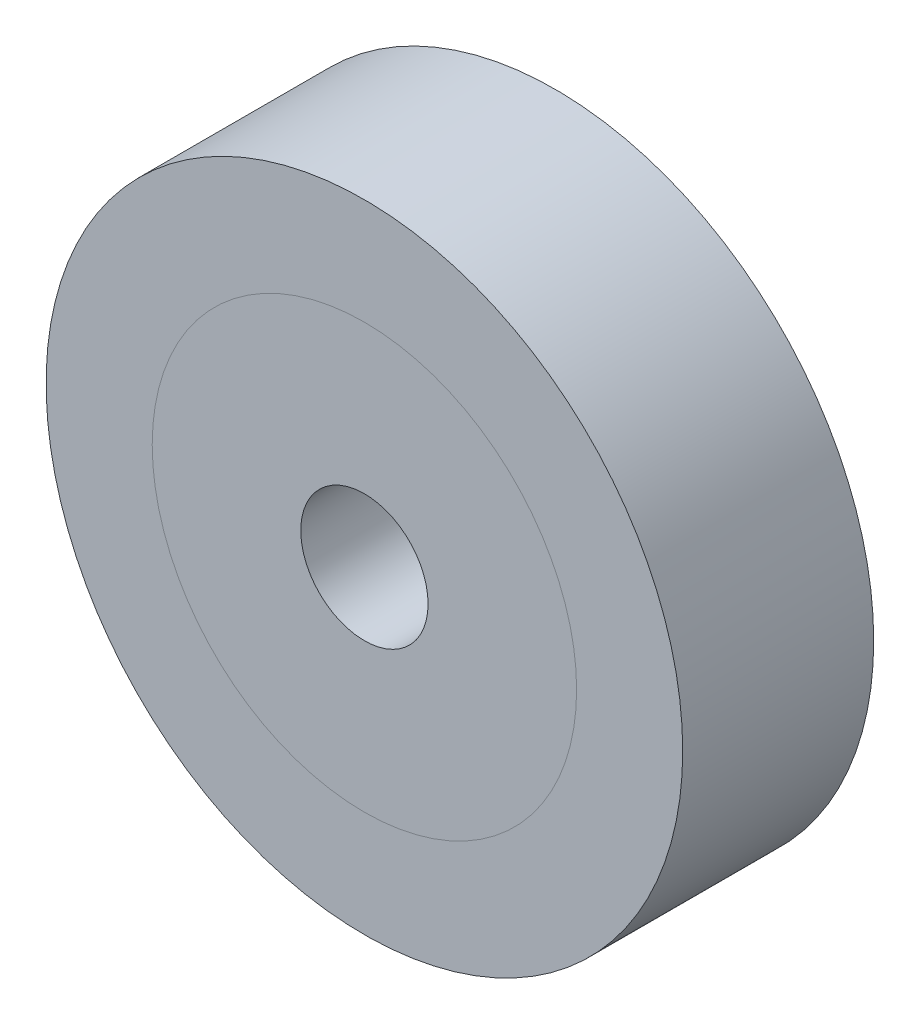
ISO-10303-21;
HEADER;
FILE_DESCRIPTION(('STEP AP214'),'2;1');
FILE_NAME('part.step','',(''),(''),'','','');
FILE_SCHEMA(('AUTOMOTIVE_DESIGN { 1 0 10303 214 1 1 1 1 }'));
ENDSEC;
DATA;
#1=APPLICATION_CONTEXT('core data for automotive mechanical design processes');
#2=APPLICATION_PROTOCOL_DEFINITION('international standard','automotive_design',2000,#1);
#3=PRODUCT_CONTEXT('',#1,'mechanical');
#4=PRODUCT('Part','Part','',(#3));
#5=PRODUCT_RELATED_PRODUCT_CATEGORY('part','',(#4));
#6=PRODUCT_DEFINITION_FORMATION('','',#4);
#7=PRODUCT_DEFINITION_CONTEXT('part definition',#1,'design');
#8=PRODUCT_DEFINITION('design','',#6,#7);
#9=PRODUCT_DEFINITION_SHAPE('','',#8);
#10=(LENGTH_UNIT() NAMED_UNIT(*) SI_UNIT(.MILLI.,.METRE.));
#11=(NAMED_UNIT(*) PLANE_ANGLE_UNIT() SI_UNIT($,.RADIAN.));
#12=(NAMED_UNIT(*) SI_UNIT($,.STERADIAN.) SOLID_ANGLE_UNIT());
#13=UNCERTAINTY_MEASURE_WITH_UNIT(LENGTH_MEASURE(1.E-05),#10,'distance_accuracy_value','');
#14=(GEOMETRIC_REPRESENTATION_CONTEXT(3) GLOBAL_UNCERTAINTY_ASSIGNED_CONTEXT((#13)) GLOBAL_UNIT_ASSIGNED_CONTEXT((#10,
#11,#12)) REPRESENTATION_CONTEXT('',''));
#15=CARTESIAN_POINT('',(0.,0.,0.));
#16=DIRECTION('',(0.,0.,1.));
#17=DIRECTION('',(1.,0.,0.));
#18=AXIS2_PLACEMENT_3D('',#15,#16,#17);
#19=CARTESIAN_POINT('',(0.,0.,-4.5));
#20=DIRECTION('',(0.,0.,1.));
#21=DIRECTION('',(1.,0.,0.));
#22=AXIS2_PLACEMENT_3D('',#19,#20,#21);
#23=PLANE('',#22);
#24=CARTESIAN_POINT('',(0.,0.,-4.5));
#25=DIRECTION('',(0.,0.,1.));
#26=DIRECTION('',(1.,0.,0.));
#27=AXIS2_PLACEMENT_3D('',#24,#25,#26);
#28=CIRCLE('',#27,15.);
#29=CARTESIAN_POINT('',(15.,0.,-4.5));
#30=VERTEX_POINT('',#29);
#31=EDGE_CURVE('E53',#30,#30,#28,.T.);
#32=ORIENTED_EDGE('',*,*,#31,.F.);
#33=EDGE_LOOP('',(#32));
#34=FACE_BOUND('',#33,.T.);
#35=CARTESIAN_POINT('',(0.,0.,-4.5));
#36=DIRECTION('',(0.,0.,1.));
#37=DIRECTION('',(1.,0.,0.));
#38=AXIS2_PLACEMENT_3D('',#35,#36,#37);
#39=CIRCLE('',#38,10.);
#40=CARTESIAN_POINT('',(10.,0.,-4.5));
#41=VERTEX_POINT('',#40);
#42=EDGE_CURVE('E10',#41,#41,#39,.F.);
#43=ORIENTED_EDGE('',*,*,#42,.F.);
#44=EDGE_LOOP('',(#43));
#45=FACE_BOUND('',#44,.T.);
#46=ADVANCED_FACE('F36',(#34,#45),#23,.F.);
#47=CARTESIAN_POINT('',(0.,0.,4.5));
#48=DIRECTION('',(0.,0.,1.));
#49=DIRECTION('',(1.,0.,0.));
#50=AXIS2_PLACEMENT_3D('',#47,#48,#49);
#51=PLANE('',#50);
#52=CARTESIAN_POINT('',(0.,0.,4.5));
#53=DIRECTION('',(0.,0.,1.));
#54=DIRECTION('',(1.,0.,0.));
#55=AXIS2_PLACEMENT_3D('',#52,#53,#54);
#56=CIRCLE('',#55,15.);
#57=CARTESIAN_POINT('',(15.,0.,4.5));
#58=VERTEX_POINT('',#57);
#59=EDGE_CURVE('E51',#58,#58,#56,.T.);
#60=ORIENTED_EDGE('',*,*,#59,.T.);
#61=EDGE_LOOP('',(#60));
#62=FACE_BOUND('',#61,.T.);
#63=CARTESIAN_POINT('',(0.,0.,4.5));
#64=DIRECTION('',(0.,0.,1.));
#65=DIRECTION('',(1.,0.,0.));
#66=AXIS2_PLACEMENT_3D('',#63,#64,#65);
#67=CIRCLE('',#66,10.);
#68=CARTESIAN_POINT('',(10.,0.,4.5));
#69=VERTEX_POINT('',#68);
#70=EDGE_CURVE('E40',#69,#69,#67,.F.);
#71=ORIENTED_EDGE('',*,*,#70,.T.);
#72=EDGE_LOOP('',(#71));
#73=FACE_BOUND('',#72,.T.);
#74=ADVANCED_FACE('F71',(#62,#73),#51,.T.);
#75=ORIENTED_EDGE('',*,*,#70,.F.);
#76=EDGE_LOOP('',(#75));
#77=FACE_BOUND('',#76,.T.);
#78=CARTESIAN_POINT('',(0.,0.,4.5));
#79=DIRECTION('',(0.,0.,1.));
#80=DIRECTION('',(1.,0.,0.));
#81=AXIS2_PLACEMENT_3D('',#78,#79,#80);
#82=CIRCLE('',#81,3.);
#83=CARTESIAN_POINT('',(3.,0.,4.5));
#84=VERTEX_POINT('',#83);
#85=EDGE_CURVE('E56',#84,#84,#82,.T.);
#86=ORIENTED_EDGE('',*,*,#85,.F.);
#87=EDGE_LOOP('',(#86));
#88=FACE_BOUND('',#87,.T.);
#89=ADVANCED_FACE('F68',(#77,#88),#51,.T.);
#90=ORIENTED_EDGE('',*,*,#42,.T.);
#91=EDGE_LOOP('',(#90));
#92=FACE_BOUND('',#91,.T.);
#93=CARTESIAN_POINT('',(0.,0.,-4.5));
#94=DIRECTION('',(0.,0.,1.));
#95=DIRECTION('',(1.,0.,0.));
#96=AXIS2_PLACEMENT_3D('',#93,#94,#95);
#97=CIRCLE('',#96,3.);
#98=CARTESIAN_POINT('',(3.,0.,-4.5));
#99=VERTEX_POINT('',#98);
#100=EDGE_CURVE('E59',#99,#99,#97,.T.);
#101=ORIENTED_EDGE('',*,*,#100,.T.);
#102=EDGE_LOOP('',(#101));
#103=FACE_BOUND('',#102,.T.);
#104=ADVANCED_FACE('F70',(#92,#103),#23,.F.);
#105=CARTESIAN_POINT('',(0.,0.,4.5));
#106=DIRECTION('',(0.,0.,-1.));
#107=DIRECTION('',(-1.,0.,0.));
#108=AXIS2_PLACEMENT_3D('',#105,#106,#107);
#109=CYLINDRICAL_SURFACE('',#108,15.);
#110=ORIENTED_EDGE('',*,*,#59,.F.);
#111=EDGE_LOOP('',(#110));
#112=FACE_BOUND('',#111,.T.);
#113=ORIENTED_EDGE('',*,*,#31,.T.);
#114=EDGE_LOOP('',(#113));
#115=FACE_BOUND('',#114,.T.);
#116=ADVANCED_FACE('F38',(#112,#115),#109,.T.);
#117=CARTESIAN_POINT('',(0.,0.,4.5));
#118=DIRECTION('',(0.,0.,-1.));
#119=DIRECTION('',(-1.,0.,0.));
#120=AXIS2_PLACEMENT_3D('',#117,#118,#119);
#121=CYLINDRICAL_SURFACE('',#120,3.);
#122=ORIENTED_EDGE('',*,*,#85,.T.);
#123=EDGE_LOOP('',(#122));
#124=FACE_BOUND('',#123,.T.);
#125=ORIENTED_EDGE('',*,*,#100,.F.);
#126=EDGE_LOOP('',(#125));
#127=FACE_BOUND('',#126,.T.);
#128=ADVANCED_FACE('F65',(#124,#127),#121,.F.);
#129=CLOSED_SHELL('',(#46,#74,#89,#104,#116,#128));
#130=MANIFOLD_SOLID_BREP('B2',#129);
#131=ADVANCED_BREP_SHAPE_REPRESENTATION('',(#18,#130),#14);
#132=SHAPE_DEFINITION_REPRESENTATION(#9,#131);
ENDSEC;
END-ISO-10303-21;
